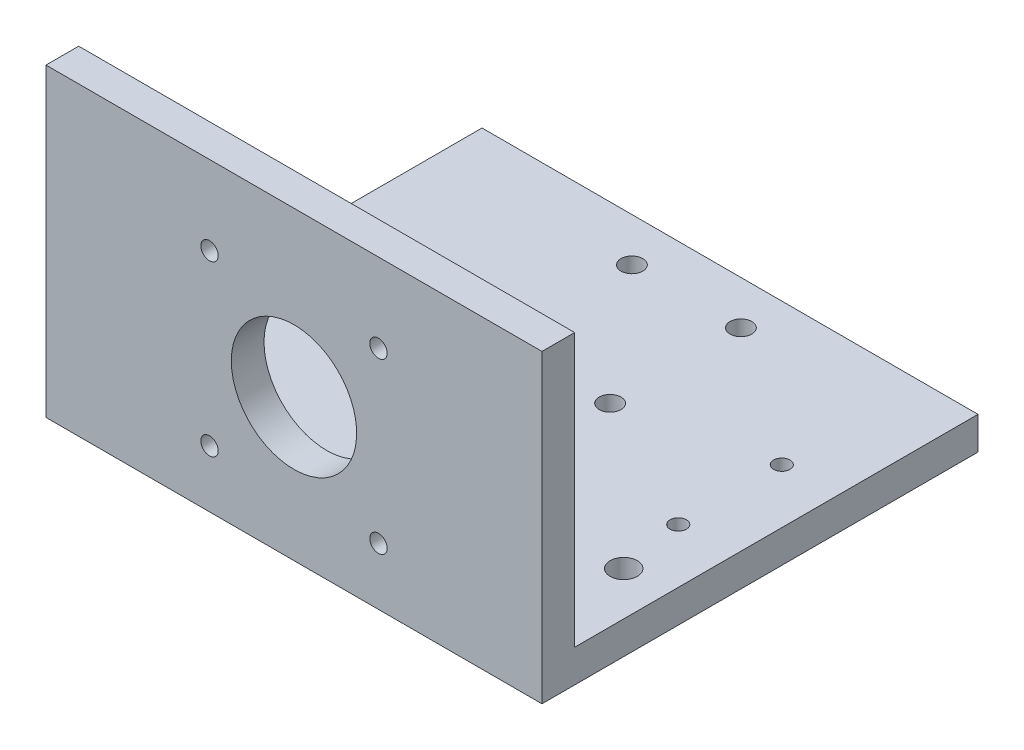
ISO-10303-21;
HEADER;
FILE_DESCRIPTION(('STEP AP214'),'2;1');
FILE_NAME('part.step','',(''),(''),'','','');
FILE_SCHEMA(('AUTOMOTIVE_DESIGN { 1 0 10303 214 1 1 1 1 }'));
ENDSEC;
DATA;
#1=APPLICATION_CONTEXT('core data for automotive mechanical design processes');
#2=APPLICATION_PROTOCOL_DEFINITION('international standard','automotive_design',2000,#1);
#3=PRODUCT_CONTEXT('',#1,'mechanical');
#4=PRODUCT('Part','Part','',(#3));
#5=PRODUCT_RELATED_PRODUCT_CATEGORY('part','',(#4));
#6=PRODUCT_DEFINITION_FORMATION('','',#4);
#7=PRODUCT_DEFINITION_CONTEXT('part definition',#1,'design');
#8=PRODUCT_DEFINITION('design','',#6,#7);
#9=PRODUCT_DEFINITION_SHAPE('','',#8);
#10=(LENGTH_UNIT() NAMED_UNIT(*) SI_UNIT(.MILLI.,.METRE.));
#11=(NAMED_UNIT(*) PLANE_ANGLE_UNIT() SI_UNIT($,.RADIAN.));
#12=(NAMED_UNIT(*) SI_UNIT($,.STERADIAN.) SOLID_ANGLE_UNIT());
#13=UNCERTAINTY_MEASURE_WITH_UNIT(LENGTH_MEASURE(1.E-05),#10,'distance_accuracy_value','');
#14=(GEOMETRIC_REPRESENTATION_CONTEXT(3) GLOBAL_UNCERTAINTY_ASSIGNED_CONTEXT((#13)) GLOBAL_UNIT_ASSIGNED_CONTEXT((#10,
#11,#12)) REPRESENTATION_CONTEXT('',''));
#15=CARTESIAN_POINT('',(0.,0.,0.));
#16=DIRECTION('',(0.,0.,1.));
#17=DIRECTION('',(1.,0.,0.));
#18=AXIS2_PLACEMENT_3D('',#15,#16,#17);
#19=CARTESIAN_POINT('',(104.,0.,0.));
#20=DIRECTION('',(0.,1.,0.));
#21=DIRECTION('',(0.,0.,1.));
#22=AXIS2_PLACEMENT_3D('',#19,#20,#21);
#23=PLANE('',#22);
#24=CARTESIAN_POINT('',(57.5,0.,-23.));
#25=DIRECTION('',(0.,1.,0.));
#26=DIRECTION('',(0.,0.,1.));
#27=AXIS2_PLACEMENT_3D('',#24,#25,#26);
#28=CIRCLE('',#27,2.49999999999999);
#29=CARTESIAN_POINT('',(57.5,0.,-20.5));
#30=VERTEX_POINT('',#29);
#31=EDGE_CURVE('E253',#30,#30,#28,.T.);
#32=ORIENTED_EDGE('',*,*,#31,.T.);
#33=EDGE_LOOP('',(#32));
#34=FACE_BOUND('',#33,.T.);
#35=CARTESIAN_POINT('',(61.,0.,-11.));
#36=DIRECTION('',(0.,1.,0.));
#37=DIRECTION('',(0.,0.,-1.));
#38=AXIS2_PLACEMENT_3D('',#35,#36,#37);
#39=CIRCLE('',#38,2.);
#40=CARTESIAN_POINT('',(61.,0.,-13.));
#41=VERTEX_POINT('',#40);
#42=EDGE_CURVE('E245',#41,#41,#39,.T.);
#43=ORIENTED_EDGE('',*,*,#42,.T.);
#44=EDGE_LOOP('',(#43));
#45=FACE_BOUND('',#44,.T.);
#46=CARTESIAN_POINT('',(61.0000000000001,0.,-35.));
#47=DIRECTION('',(0.,1.,0.));
#48=DIRECTION('',(0.,0.,-1.));
#49=AXIS2_PLACEMENT_3D('',#46,#47,#48);
#50=CIRCLE('',#49,1.99999999999999);
#51=CARTESIAN_POINT('',(61.0000000000001,0.,-37.));
#52=VERTEX_POINT('',#51);
#53=EDGE_CURVE('E237',#52,#52,#50,.T.);
#54=ORIENTED_EDGE('',*,*,#53,.T.);
#55=EDGE_LOOP('',(#54));
#56=FACE_BOUND('',#55,.T.);
#57=CARTESIAN_POINT('',(62.,0.,-48.));
#58=DIRECTION('',(0.,1.,0.));
#59=DIRECTION('',(0.,0.,-1.));
#60=AXIS2_PLACEMENT_3D('',#57,#58,#59);
#61=CIRCLE('',#60,1.99999999999998);
#62=CARTESIAN_POINT('',(62.,0.,-50.));
#63=VERTEX_POINT('',#62);
#64=EDGE_CURVE('E228',#63,#63,#61,.T.);
#65=ORIENTED_EDGE('',*,*,#64,.T.);
#66=EDGE_LOOP('',(#65));
#67=FACE_BOUND('',#66,.T.);
#68=CARTESIAN_POINT('',(62.,0.,-72.));
#69=DIRECTION('',(0.,1.,0.));
#70=DIRECTION('',(0.,0.,-1.));
#71=AXIS2_PLACEMENT_3D('',#68,#69,#70);
#72=CIRCLE('',#71,2.);
#73=CARTESIAN_POINT('',(62.,0.,-74.));
#74=VERTEX_POINT('',#73);
#75=EDGE_CURVE('E285',#74,#74,#72,.T.);
#76=ORIENTED_EDGE('',*,*,#75,.T.);
#77=EDGE_LOOP('',(#76));
#78=FACE_BOUND('',#77,.T.);
#79=CARTESIAN_POINT('',(42.,0.,-72.));
#80=DIRECTION('',(0.,1.,0.));
#81=DIRECTION('',(0.,0.,1.));
#82=AXIS2_PLACEMENT_3D('',#79,#80,#81);
#83=CIRCLE('',#82,2.);
#84=CARTESIAN_POINT('',(42.,0.,-70.));
#85=VERTEX_POINT('',#84);
#86=EDGE_CURVE('E277',#85,#85,#83,.T.);
#87=ORIENTED_EDGE('',*,*,#86,.T.);
#88=EDGE_LOOP('',(#87));
#89=FACE_BOUND('',#88,.T.);
#90=CARTESIAN_POINT('',(42.,0.,-48.));
#91=DIRECTION('',(0.,1.,0.));
#92=DIRECTION('',(0.,0.,1.));
#93=AXIS2_PLACEMENT_3D('',#90,#91,#92);
#94=CIRCLE('',#93,2.);
#95=CARTESIAN_POINT('',(42.,0.,-46.));
#96=VERTEX_POINT('',#95);
#97=EDGE_CURVE('E269',#96,#96,#94,.T.);
#98=ORIENTED_EDGE('',*,*,#97,.T.);
#99=EDGE_LOOP('',(#98));
#100=FACE_BOUND('',#99,.T.);
#101=CARTESIAN_POINT('',(42.9999999999999,0.,-35.));
#102=DIRECTION('',(0.,1.,0.));
#103=DIRECTION('',(0.,0.,1.));
#104=AXIS2_PLACEMENT_3D('',#101,#102,#103);
#105=CIRCLE('',#104,2.);
#106=CARTESIAN_POINT('',(42.9999999999999,0.,-33.));
#107=VERTEX_POINT('',#106);
#108=EDGE_CURVE('E260',#107,#107,#105,.T.);
#109=ORIENTED_EDGE('',*,*,#108,.T.);
#110=EDGE_LOOP('',(#109));
#111=FACE_BOUND('',#110,.T.);
#112=CARTESIAN_POINT('',(87.5,0.,-35.));
#113=DIRECTION('',(0.,1.,0.));
#114=DIRECTION('',(0.,0.,-1.));
#115=AXIS2_PLACEMENT_3D('',#112,#113,#114);
#116=CIRCLE('',#115,1.5);
#117=CARTESIAN_POINT('',(87.5,0.,-36.5));
#118=VERTEX_POINT('',#117);
#119=EDGE_CURVE('E189',#118,#118,#116,.T.);
#120=ORIENTED_EDGE('',*,*,#119,.T.);
#121=EDGE_LOOP('',(#120));
#122=FACE_BOUND('',#121,.T.);
#123=CARTESIAN_POINT('',(87.5,0.,-54.));
#124=DIRECTION('',(0.,1.,0.));
#125=DIRECTION('',(0.,0.,-1.));
#126=AXIS2_PLACEMENT_3D('',#123,#124,#125);
#127=CIRCLE('',#126,1.5);
#128=CARTESIAN_POINT('',(87.5,0.,-55.5));
#129=VERTEX_POINT('',#128);
#130=EDGE_CURVE('E174',#129,#129,#127,.T.);
#131=ORIENTED_EDGE('',*,*,#130,.T.);
#132=EDGE_LOOP('',(#131));
#133=FACE_BOUND('',#132,.T.);
#134=CARTESIAN_POINT('',(89.5,0.,-23.));
#135=DIRECTION('',(0.,1.,0.));
#136=DIRECTION('',(0.,0.,1.));
#137=AXIS2_PLACEMENT_3D('',#134,#135,#136);
#138=CIRCLE('',#137,2.5);
#139=CARTESIAN_POINT('',(89.5,0.,-20.5));
#140=VERTEX_POINT('',#139);
#141=EDGE_CURVE('E212',#140,#140,#138,.T.);
#142=ORIENTED_EDGE('',*,*,#141,.T.);
#143=EDGE_LOOP('',(#142));
#144=FACE_BOUND('',#143,.T.);
#145=CARTESIAN_POINT('',(46.5,0.,-23.));
#146=DIRECTION('',(0.,1.,0.));
#147=DIRECTION('',(0.,0.,-1.));
#148=AXIS2_PLACEMENT_3D('',#145,#146,#147);
#149=CIRCLE('',#148,2.49999999999999);
#150=CARTESIAN_POINT('',(46.5,0.,-25.5));
#151=VERTEX_POINT('',#150);
#152=EDGE_CURVE('E221',#151,#151,#149,.T.);
#153=ORIENTED_EDGE('',*,*,#152,.T.);
#154=EDGE_LOOP('',(#153));
#155=FACE_BOUND('',#154,.T.);
#156=CARTESIAN_POINT('',(14.5,0.,-23.));
#157=DIRECTION('',(0.,1.,0.));
#158=DIRECTION('',(0.,0.,-1.));
#159=AXIS2_PLACEMENT_3D('',#156,#157,#158);
#160=CIRCLE('',#159,2.5);
#161=CARTESIAN_POINT('',(14.5,0.,-25.5));
#162=VERTEX_POINT('',#161);
#163=EDGE_CURVE('E199',#162,#162,#160,.T.);
#164=ORIENTED_EDGE('',*,*,#163,.T.);
#165=EDGE_LOOP('',(#164));
#166=FACE_BOUND('',#165,.T.);
#167=CARTESIAN_POINT('',(43.,0.,-11.));
#168=DIRECTION('',(0.,1.,0.));
#169=DIRECTION('',(0.,0.,1.));
#170=AXIS2_PLACEMENT_3D('',#167,#168,#169);
#171=CIRCLE('',#170,2.);
#172=CARTESIAN_POINT('',(43.,0.,-9.00000000000001));
#173=VERTEX_POINT('',#172);
#174=EDGE_CURVE('E292',#173,#173,#171,.T.);
#175=ORIENTED_EDGE('',*,*,#174,.T.);
#176=EDGE_LOOP('',(#175));
#177=FACE_BOUND('',#176,.T.);
#178=DIRECTION('',(-1.,0.,0.));
#179=VECTOR('',#178,1.);
#180=CARTESIAN_POINT('',(104.,0.,0.));
#181=LINE('',#180,#179);
#182=CARTESIAN_POINT('',(97.5,0.,0.));
#183=VERTEX_POINT('',#182);
#184=CARTESIAN_POINT('',(6.49999999999999,0.,0.));
#185=VERTEX_POINT('',#184);
#186=EDGE_CURVE('E11',#183,#185,#181,.T.);
#187=ORIENTED_EDGE('',*,*,#186,.T.);
#188=DIRECTION('',(0.,0.,-1.));
#189=VECTOR('',#188,1.);
#190=CARTESIAN_POINT('',(6.49999999999999,0.,-6.00000000000001));
#191=LINE('',#190,#189);
#192=CARTESIAN_POINT('',(6.49999999999999,0.,-80.));
#193=VERTEX_POINT('',#192);
#194=EDGE_CURVE('E182',#185,#193,#191,.T.);
#195=ORIENTED_EDGE('',*,*,#194,.T.);
#196=DIRECTION('',(-1.,0.,0.));
#197=VECTOR('',#196,1.);
#198=CARTESIAN_POINT('',(104.,0.,-80.));
#199=LINE('',#198,#197);
#200=CARTESIAN_POINT('',(97.5,0.,-80.));
#201=VERTEX_POINT('',#200);
#202=EDGE_CURVE('E50',#201,#193,#199,.T.);
#203=ORIENTED_EDGE('',*,*,#202,.F.);
#204=DIRECTION('',(0.,0.,1.));
#205=VECTOR('',#204,1.);
#206=CARTESIAN_POINT('',(97.5,0.,-6.00000000000001));
#207=LINE('',#206,#205);
#208=EDGE_CURVE('E56',#201,#183,#207,.T.);
#209=ORIENTED_EDGE('',*,*,#208,.T.);
#210=EDGE_LOOP('',(#187,#195,#203,#209));
#211=FACE_BOUND('',#210,.T.);
#212=ADVANCED_FACE('F41',(#34,#45,#56,#67,#78,#89,#100,#111,#122,#133,#144,#155,#166,#177,#211),
#23,.F.);
#213=CARTESIAN_POINT('',(104.,0.,-80.));
#214=DIRECTION('',(0.,0.,1.));
#215=DIRECTION('',(1.,0.,0.));
#216=AXIS2_PLACEMENT_3D('',#213,#214,#215);
#217=PLANE('',#216);
#218=ORIENTED_EDGE('',*,*,#202,.T.);
#219=DIRECTION('',(0.,1.,0.));
#220=VECTOR('',#219,1.);
#221=CARTESIAN_POINT('',(6.49999999999999,0.,-80.));
#222=LINE('',#221,#220);
#223=CARTESIAN_POINT('',(6.49999999999999,6.,-80.));
#224=VERTEX_POINT('',#223);
#225=EDGE_CURVE('E185',#193,#224,#222,.T.);
#226=ORIENTED_EDGE('',*,*,#225,.T.);
#227=DIRECTION('',(-1.,0.,0.));
#228=VECTOR('',#227,1.);
#229=CARTESIAN_POINT('',(104.,6.,-80.));
#230=LINE('',#229,#228);
#231=CARTESIAN_POINT('',(97.5,6.,-80.));
#232=VERTEX_POINT('',#231);
#233=EDGE_CURVE('E303',#232,#224,#230,.T.);
#234=ORIENTED_EDGE('',*,*,#233,.F.);
#235=DIRECTION('',(0.,1.,0.));
#236=VECTOR('',#235,1.);
#237=CARTESIAN_POINT('',(97.5,0.,-80.));
#238=LINE('',#237,#236);
#239=EDGE_CURVE('E93',#201,#232,#238,.T.);
#240=ORIENTED_EDGE('',*,*,#239,.F.);
#241=EDGE_LOOP('',(#218,#226,#234,#240));
#242=FACE_BOUND('',#241,.T.);
#243=ADVANCED_FACE('F308',(#242),#217,.F.);
#244=CARTESIAN_POINT('',(104.,6.,-6.));
#245=DIRECTION('',(0.,-1.,0.));
#246=DIRECTION('',(0.,0.,-1.));
#247=AXIS2_PLACEMENT_3D('',#244,#245,#246);
#248=PLANE('',#247);
#249=CARTESIAN_POINT('',(57.5,6.,-23.));
#250=DIRECTION('',(0.,1.,0.));
#251=DIRECTION('',(0.,0.,1.));
#252=AXIS2_PLACEMENT_3D('',#249,#250,#251);
#253=CIRCLE('',#252,2.49999999999999);
#254=CARTESIAN_POINT('',(57.5,6.,-20.5));
#255=VERTEX_POINT('',#254);
#256=EDGE_CURVE('E216',#255,#255,#253,.T.);
#257=ORIENTED_EDGE('',*,*,#256,.F.);
#258=EDGE_LOOP('',(#257));
#259=FACE_BOUND('',#258,.T.);
#260=CARTESIAN_POINT('',(61.,6.,-11.));
#261=DIRECTION('',(0.,1.,0.));
#262=DIRECTION('',(0.,0.,-1.));
#263=AXIS2_PLACEMENT_3D('',#260,#261,#262);
#264=CIRCLE('',#263,2.);
#265=CARTESIAN_POINT('',(61.,6.,-13.));
#266=VERTEX_POINT('',#265);
#267=EDGE_CURVE('E249',#266,#266,#264,.T.);
#268=ORIENTED_EDGE('',*,*,#267,.F.);
#269=EDGE_LOOP('',(#268));
#270=FACE_BOUND('',#269,.T.);
#271=CARTESIAN_POINT('',(61.0000000000001,6.,-35.));
#272=DIRECTION('',(0.,1.,0.));
#273=DIRECTION('',(0.,0.,-1.));
#274=AXIS2_PLACEMENT_3D('',#271,#272,#273);
#275=CIRCLE('',#274,1.99999999999999);
#276=CARTESIAN_POINT('',(61.0000000000001,6.,-37.));
#277=VERTEX_POINT('',#276);
#278=EDGE_CURVE('E241',#277,#277,#275,.T.);
#279=ORIENTED_EDGE('',*,*,#278,.F.);
#280=EDGE_LOOP('',(#279));
#281=FACE_BOUND('',#280,.T.);
#282=CARTESIAN_POINT('',(62.,6.,-48.));
#283=DIRECTION('',(0.,1.,0.));
#284=DIRECTION('',(0.,0.,-1.));
#285=AXIS2_PLACEMENT_3D('',#282,#283,#284);
#286=CIRCLE('',#285,1.99999999999998);
#287=CARTESIAN_POINT('',(62.,6.,-50.));
#288=VERTEX_POINT('',#287);
#289=EDGE_CURVE('E233',#288,#288,#286,.T.);
#290=ORIENTED_EDGE('',*,*,#289,.F.);
#291=EDGE_LOOP('',(#290));
#292=FACE_BOUND('',#291,.T.);
#293=CARTESIAN_POINT('',(62.,6.,-72.));
#294=DIRECTION('',(0.,1.,0.));
#295=DIRECTION('',(0.,0.,-1.));
#296=AXIS2_PLACEMENT_3D('',#293,#294,#295);
#297=CIRCLE('',#296,2.);
#298=CARTESIAN_POINT('',(62.,6.,-74.));
#299=VERTEX_POINT('',#298);
#300=EDGE_CURVE('E232',#299,#299,#297,.T.);
#301=ORIENTED_EDGE('',*,*,#300,.F.);
#302=EDGE_LOOP('',(#301));
#303=FACE_BOUND('',#302,.T.);
#304=CARTESIAN_POINT('',(42.,6.,-72.));
#305=DIRECTION('',(0.,1.,0.));
#306=DIRECTION('',(0.,0.,1.));
#307=AXIS2_PLACEMENT_3D('',#304,#305,#306);
#308=CIRCLE('',#307,2.);
#309=CARTESIAN_POINT('',(42.,6.,-70.));
#310=VERTEX_POINT('',#309);
#311=EDGE_CURVE('E281',#310,#310,#308,.T.);
#312=ORIENTED_EDGE('',*,*,#311,.F.);
#313=EDGE_LOOP('',(#312));
#314=FACE_BOUND('',#313,.T.);
#315=CARTESIAN_POINT('',(42.,6.,-48.));
#316=DIRECTION('',(0.,1.,0.));
#317=DIRECTION('',(0.,0.,1.));
#318=AXIS2_PLACEMENT_3D('',#315,#316,#317);
#319=CIRCLE('',#318,2.);
#320=CARTESIAN_POINT('',(42.,6.,-46.));
#321=VERTEX_POINT('',#320);
#322=EDGE_CURVE('E273',#321,#321,#319,.T.);
#323=ORIENTED_EDGE('',*,*,#322,.F.);
#324=EDGE_LOOP('',(#323));
#325=FACE_BOUND('',#324,.T.);
#326=CARTESIAN_POINT('',(42.9999999999999,6.,-35.));
#327=DIRECTION('',(0.,1.,0.));
#328=DIRECTION('',(0.,0.,1.));
#329=AXIS2_PLACEMENT_3D('',#326,#327,#328);
#330=CIRCLE('',#329,2.);
#331=CARTESIAN_POINT('',(42.9999999999999,6.,-33.));
#332=VERTEX_POINT('',#331);
#333=EDGE_CURVE('E265',#332,#332,#330,.T.);
#334=ORIENTED_EDGE('',*,*,#333,.F.);
#335=EDGE_LOOP('',(#334));
#336=FACE_BOUND('',#335,.T.);
#337=CARTESIAN_POINT('',(87.5,6.,-35.));
#338=DIRECTION('',(0.,1.,0.));
#339=DIRECTION('',(0.,0.,-1.));
#340=AXIS2_PLACEMENT_3D('',#337,#338,#339);
#341=CIRCLE('',#340,1.5);
#342=CARTESIAN_POINT('',(87.5,6.,-36.5));
#343=VERTEX_POINT('',#342);
#344=EDGE_CURVE('E178',#343,#343,#341,.T.);
#345=ORIENTED_EDGE('',*,*,#344,.F.);
#346=EDGE_LOOP('',(#345));
#347=FACE_BOUND('',#346,.T.);
#348=CARTESIAN_POINT('',(87.5,6.,-54.));
#349=DIRECTION('',(0.,1.,0.));
#350=DIRECTION('',(0.,0.,-1.));
#351=AXIS2_PLACEMENT_3D('',#348,#349,#350);
#352=CIRCLE('',#351,1.5);
#353=CARTESIAN_POINT('',(87.5,6.,-55.5));
#354=VERTEX_POINT('',#353);
#355=EDGE_CURVE('E170',#354,#354,#352,.T.);
#356=ORIENTED_EDGE('',*,*,#355,.F.);
#357=EDGE_LOOP('',(#356));
#358=FACE_BOUND('',#357,.T.);
#359=CARTESIAN_POINT('',(89.5,6.,-23.));
#360=DIRECTION('',(0.,1.,0.));
#361=DIRECTION('',(0.,0.,1.));
#362=AXIS2_PLACEMENT_3D('',#359,#360,#361);
#363=CIRCLE('',#362,2.5);
#364=CARTESIAN_POINT('',(89.5,6.,-20.5));
#365=VERTEX_POINT('',#364);
#366=EDGE_CURVE('E217',#365,#365,#363,.T.);
#367=ORIENTED_EDGE('',*,*,#366,.F.);
#368=EDGE_LOOP('',(#367));
#369=FACE_BOUND('',#368,.T.);
#370=CARTESIAN_POINT('',(46.5,6.,-23.));
#371=DIRECTION('',(0.,1.,0.));
#372=DIRECTION('',(0.,0.,-1.));
#373=AXIS2_PLACEMENT_3D('',#370,#371,#372);
#374=CIRCLE('',#373,2.49999999999999);
#375=CARTESIAN_POINT('',(46.5,6.,-25.5));
#376=VERTEX_POINT('',#375);
#377=EDGE_CURVE('E203',#376,#376,#374,.T.);
#378=ORIENTED_EDGE('',*,*,#377,.F.);
#379=EDGE_LOOP('',(#378));
#380=FACE_BOUND('',#379,.T.);
#381=CARTESIAN_POINT('',(14.5,6.,-23.));
#382=DIRECTION('',(0.,1.,0.));
#383=DIRECTION('',(0.,0.,-1.));
#384=AXIS2_PLACEMENT_3D('',#381,#382,#383);
#385=CIRCLE('',#384,2.5);
#386=CARTESIAN_POINT('',(14.5,6.,-25.5));
#387=VERTEX_POINT('',#386);
#388=EDGE_CURVE('E204',#387,#387,#385,.T.);
#389=ORIENTED_EDGE('',*,*,#388,.F.);
#390=EDGE_LOOP('',(#389));
#391=FACE_BOUND('',#390,.T.);
#392=CARTESIAN_POINT('',(43.,6.,-11.));
#393=DIRECTION('',(0.,1.,0.));
#394=DIRECTION('',(0.,0.,1.));
#395=AXIS2_PLACEMENT_3D('',#392,#393,#394);
#396=CIRCLE('',#395,2.);
#397=CARTESIAN_POINT('',(43.,6.,-9.00000000000001));
#398=VERTEX_POINT('',#397);
#399=EDGE_CURVE('E264',#398,#398,#396,.T.);
#400=ORIENTED_EDGE('',*,*,#399,.F.);
#401=EDGE_LOOP('',(#400));
#402=FACE_BOUND('',#401,.T.);
#403=ORIENTED_EDGE('',*,*,#233,.T.);
#404=DIRECTION('',(0.,0.,-1.));
#405=VECTOR('',#404,1.);
#406=CARTESIAN_POINT('',(6.49999999999999,6.,-6.00000000000001));
#407=LINE('',#406,#405);
#408=CARTESIAN_POINT('',(6.49999999999999,6.,-6.));
#409=VERTEX_POINT('',#408);
#410=EDGE_CURVE('E186',#409,#224,#407,.T.);
#411=ORIENTED_EDGE('',*,*,#410,.F.);
#412=DIRECTION('',(-1.,0.,0.));
#413=VECTOR('',#412,1.);
#414=CARTESIAN_POINT('',(104.,6.,-6.));
#415=LINE('',#414,#413);
#416=CARTESIAN_POINT('',(97.5,6.,-6.));
#417=VERTEX_POINT('',#416);
#418=EDGE_CURVE('E296',#417,#409,#415,.T.);
#419=ORIENTED_EDGE('',*,*,#418,.F.);
#420=DIRECTION('',(0.,0.,1.));
#421=VECTOR('',#420,1.);
#422=CARTESIAN_POINT('',(97.5,6.,-6.00000000000001));
#423=LINE('',#422,#421);
#424=EDGE_CURVE('E94',#232,#417,#423,.T.);
#425=ORIENTED_EDGE('',*,*,#424,.F.);
#426=EDGE_LOOP('',(#403,#411,#419,#425));
#427=FACE_BOUND('',#426,.T.);
#428=ADVANCED_FACE('F313',(#259,#270,#281,#292,#303,#314,#325,#336,#347,#358,#369,#380,#391,
#402,#427),#248,.F.);
#429=CARTESIAN_POINT('',(104.,6.,-6.));
#430=DIRECTION('',(0.,0.,1.));
#431=DIRECTION('',(1.,0.,0.));
#432=AXIS2_PLACEMENT_3D('',#429,#430,#431);
#433=PLANE('',#432);
#434=CARTESIAN_POINT('',(36.5,41.5,-6.));
#435=DIRECTION('',(0.,0.,-1.));
#436=DIRECTION('',(-1.,0.,0.));
#437=AXIS2_PLACEMENT_3D('',#434,#435,#436);
#438=CIRCLE('',#437,1.6);
#439=CARTESIAN_POINT('',(34.9,41.5,-6.));
#440=VERTEX_POINT('',#439);
#441=EDGE_CURVE('E139',#440,#440,#438,.T.);
#442=ORIENTED_EDGE('',*,*,#441,.F.);
#443=EDGE_LOOP('',(#442));
#444=FACE_BOUND('',#443,.T.);
#445=CARTESIAN_POINT('',(67.5,41.5,-6.));
#446=DIRECTION('',(0.,0.,-1.));
#447=DIRECTION('',(1.,0.,0.));
#448=AXIS2_PLACEMENT_3D('',#445,#446,#447);
#449=CIRCLE('',#448,1.59999999999999);
#450=CARTESIAN_POINT('',(69.1,41.5,-6.));
#451=VERTEX_POINT('',#450);
#452=EDGE_CURVE('E147',#451,#451,#449,.T.);
#453=ORIENTED_EDGE('',*,*,#452,.F.);
#454=EDGE_LOOP('',(#453));
#455=FACE_BOUND('',#454,.T.);
#456=CARTESIAN_POINT('',(67.5,10.5,-6.));
#457=DIRECTION('',(0.,0.,-1.));
#458=DIRECTION('',(-1.,0.,0.));
#459=AXIS2_PLACEMENT_3D('',#456,#457,#458);
#460=CIRCLE('',#459,1.59999999999999);
#461=CARTESIAN_POINT('',(65.9,10.5,-6.));
#462=VERTEX_POINT('',#461);
#463=EDGE_CURVE('E155',#462,#462,#460,.T.);
#464=ORIENTED_EDGE('',*,*,#463,.F.);
#465=EDGE_LOOP('',(#464));
#466=FACE_BOUND('',#465,.T.);
#467=CARTESIAN_POINT('',(36.5,10.5,-6.));
#468=DIRECTION('',(0.,0.,-1.));
#469=DIRECTION('',(1.,0.,0.));
#470=AXIS2_PLACEMENT_3D('',#467,#468,#469);
#471=CIRCLE('',#470,1.6);
#472=CARTESIAN_POINT('',(38.1,10.5,-6.));
#473=VERTEX_POINT('',#472);
#474=EDGE_CURVE('E132',#473,#473,#471,.T.);
#475=ORIENTED_EDGE('',*,*,#474,.F.);
#476=EDGE_LOOP('',(#475));
#477=FACE_BOUND('',#476,.T.);
#478=CARTESIAN_POINT('',(52.,26.,-6.));
#479=DIRECTION('',(0.,0.,-1.));
#480=DIRECTION('',(-1.,0.,0.));
#481=AXIS2_PLACEMENT_3D('',#478,#479,#480);
#482=CIRCLE('',#481,11.5);
#483=CARTESIAN_POINT('',(40.5,26.,-6.));
#484=VERTEX_POINT('',#483);
#485=EDGE_CURVE('E138',#484,#484,#482,.T.);
#486=ORIENTED_EDGE('',*,*,#485,.F.);
#487=EDGE_LOOP('',(#486));
#488=FACE_BOUND('',#487,.T.);
#489=ORIENTED_EDGE('',*,*,#418,.T.);
#490=DIRECTION('',(0.,-1.,0.));
#491=VECTOR('',#490,1.);
#492=CARTESIAN_POINT('',(6.49999999999999,0.,-6.));
#493=LINE('',#492,#491);
#494=CARTESIAN_POINT('',(6.49999999999999,56.,-6.));
#495=VERTEX_POINT('',#494);
#496=EDGE_CURVE('E107',#495,#409,#493,.T.);
#497=ORIENTED_EDGE('',*,*,#496,.F.);
#498=DIRECTION('',(-1.,0.,0.));
#499=VECTOR('',#498,1.);
#500=CARTESIAN_POINT('',(97.5,56.,-6.));
#501=LINE('',#500,#499);
#502=CARTESIAN_POINT('',(97.5,56.,-6.));
#503=VERTEX_POINT('',#502);
#504=EDGE_CURVE('E125',#503,#495,#501,.T.);
#505=ORIENTED_EDGE('',*,*,#504,.F.);
#506=DIRECTION('',(0.,1.,0.));
#507=VECTOR('',#506,1.);
#508=CARTESIAN_POINT('',(97.5,0.,-6.));
#509=LINE('',#508,#507);
#510=EDGE_CURVE('E122',#417,#503,#509,.T.);
#511=ORIENTED_EDGE('',*,*,#510,.F.);
#512=EDGE_LOOP('',(#489,#497,#505,#511));
#513=FACE_BOUND('',#512,.T.);
#514=ADVANCED_FACE('F317',(#444,#455,#466,#477,#488,#513),#433,.F.);
#515=CARTESIAN_POINT('',(104.,6.,0.));
#516=DIRECTION('',(0.,0.,-1.));
#517=DIRECTION('',(-1.,0.,0.));
#518=AXIS2_PLACEMENT_3D('',#515,#516,#517);
#519=PLANE('',#518);
#520=CARTESIAN_POINT('',(36.5,41.5,0.));
#521=DIRECTION('',(0.,0.,-1.));
#522=DIRECTION('',(-1.,0.,0.));
#523=AXIS2_PLACEMENT_3D('',#520,#521,#522);
#524=CIRCLE('',#523,1.6);
#525=CARTESIAN_POINT('',(34.9,41.5,0.));
#526=VERTEX_POINT('',#525);
#527=EDGE_CURVE('E134',#526,#526,#524,.T.);
#528=ORIENTED_EDGE('',*,*,#527,.T.);
#529=EDGE_LOOP('',(#528));
#530=FACE_BOUND('',#529,.T.);
#531=CARTESIAN_POINT('',(67.5,41.5,0.));
#532=DIRECTION('',(0.,0.,-1.));
#533=DIRECTION('',(1.,0.,0.));
#534=AXIS2_PLACEMENT_3D('',#531,#532,#533);
#535=CIRCLE('',#534,1.59999999999999);
#536=CARTESIAN_POINT('',(69.1,41.5,0.));
#537=VERTEX_POINT('',#536);
#538=EDGE_CURVE('E143',#537,#537,#535,.T.);
#539=ORIENTED_EDGE('',*,*,#538,.T.);
#540=EDGE_LOOP('',(#539));
#541=FACE_BOUND('',#540,.T.);
#542=CARTESIAN_POINT('',(67.5,10.5,0.));
#543=DIRECTION('',(0.,0.,-1.));
#544=DIRECTION('',(-1.,0.,0.));
#545=AXIS2_PLACEMENT_3D('',#542,#543,#544);
#546=CIRCLE('',#545,1.59999999999999);
#547=CARTESIAN_POINT('',(65.9,10.5,0.));
#548=VERTEX_POINT('',#547);
#549=EDGE_CURVE('E151',#548,#548,#546,.T.);
#550=ORIENTED_EDGE('',*,*,#549,.T.);
#551=EDGE_LOOP('',(#550));
#552=FACE_BOUND('',#551,.T.);
#553=CARTESIAN_POINT('',(36.5,10.5,0.));
#554=DIRECTION('',(0.,0.,-1.));
#555=DIRECTION('',(1.,0.,0.));
#556=AXIS2_PLACEMENT_3D('',#553,#554,#555);
#557=CIRCLE('',#556,1.6);
#558=CARTESIAN_POINT('',(38.1,10.5,0.));
#559=VERTEX_POINT('',#558);
#560=EDGE_CURVE('E159',#559,#559,#557,.T.);
#561=ORIENTED_EDGE('',*,*,#560,.T.);
#562=EDGE_LOOP('',(#561));
#563=FACE_BOUND('',#562,.T.);
#564=CARTESIAN_POINT('',(52.,26.,0.));
#565=DIRECTION('',(0.,0.,-1.));
#566=DIRECTION('',(-1.,0.,0.));
#567=AXIS2_PLACEMENT_3D('',#564,#565,#566);
#568=CIRCLE('',#567,11.5);
#569=CARTESIAN_POINT('',(40.5,26.,0.));
#570=VERTEX_POINT('',#569);
#571=EDGE_CURVE('E166',#570,#570,#568,.T.);
#572=ORIENTED_EDGE('',*,*,#571,.T.);
#573=EDGE_LOOP('',(#572));
#574=FACE_BOUND('',#573,.T.);
#575=DIRECTION('',(-1.,0.,0.));
#576=VECTOR('',#575,1.);
#577=CARTESIAN_POINT('',(97.5,56.,0.));
#578=LINE('',#577,#576);
#579=CARTESIAN_POINT('',(97.5,56.,0.));
#580=VERTEX_POINT('',#579);
#581=CARTESIAN_POINT('',(6.49999999999999,56.,0.));
#582=VERTEX_POINT('',#581);
#583=EDGE_CURVE('E106',#580,#582,#578,.T.);
#584=ORIENTED_EDGE('',*,*,#583,.T.);
#585=DIRECTION('',(0.,-1.,0.));
#586=VECTOR('',#585,1.);
#587=CARTESIAN_POINT('',(6.49999999999999,0.,0.));
#588=LINE('',#587,#586);
#589=EDGE_CURVE('E112',#582,#185,#588,.T.);
#590=ORIENTED_EDGE('',*,*,#589,.T.);
#591=ORIENTED_EDGE('',*,*,#186,.F.);
#592=DIRECTION('',(0.,1.,0.));
#593=VECTOR('',#592,1.);
#594=CARTESIAN_POINT('',(97.5,0.,0.));
#595=LINE('',#594,#593);
#596=EDGE_CURVE('E97',#183,#580,#595,.T.);
#597=ORIENTED_EDGE('',*,*,#596,.T.);
#598=EDGE_LOOP('',(#584,#590,#591,#597));
#599=FACE_BOUND('',#598,.T.);
#600=ADVANCED_FACE('F110',(#530,#541,#552,#563,#574,#599),#519,.F.);
#601=CARTESIAN_POINT('',(6.49999999999999,0.,-6.00000000000001));
#602=DIRECTION('',(1.,0.,0.));
#603=DIRECTION('',(0.,0.,-1.));
#604=AXIS2_PLACEMENT_3D('',#601,#602,#603);
#605=PLANE('',#604);
#606=ORIENTED_EDGE('',*,*,#410,.T.);
#607=ORIENTED_EDGE('',*,*,#225,.F.);
#608=ORIENTED_EDGE('',*,*,#194,.F.);
#609=ORIENTED_EDGE('',*,*,#589,.F.);
#610=DIRECTION('',(0.,0.,-1.));
#611=VECTOR('',#610,1.);
#612=CARTESIAN_POINT('',(6.49999999999999,56.,0.));
#613=LINE('',#612,#611);
#614=EDGE_CURVE('E118',#582,#495,#613,.T.);
#615=ORIENTED_EDGE('',*,*,#614,.T.);
#616=ORIENTED_EDGE('',*,*,#496,.T.);
#617=EDGE_LOOP('',(#606,#607,#608,#609,#615,#616));
#618=FACE_BOUND('',#617,.T.);
#619=ADVANCED_FACE('F321',(#618),#605,.F.);
#620=CARTESIAN_POINT('',(97.5,0.,-6.00000000000001));
#621=DIRECTION('',(-1.,0.,0.));
#622=DIRECTION('',(0.,0.,1.));
#623=AXIS2_PLACEMENT_3D('',#620,#621,#622);
#624=PLANE('',#623);
#625=ORIENTED_EDGE('',*,*,#424,.T.);
#626=ORIENTED_EDGE('',*,*,#510,.T.);
#627=DIRECTION('',(0.,0.,-1.));
#628=VECTOR('',#627,1.);
#629=CARTESIAN_POINT('',(97.5,56.,0.));
#630=LINE('',#629,#628);
#631=EDGE_CURVE('E101',#580,#503,#630,.T.);
#632=ORIENTED_EDGE('',*,*,#631,.F.);
#633=ORIENTED_EDGE('',*,*,#596,.F.);
#634=ORIENTED_EDGE('',*,*,#208,.F.);
#635=ORIENTED_EDGE('',*,*,#239,.T.);
#636=EDGE_LOOP('',(#625,#626,#632,#633,#634,#635));
#637=FACE_BOUND('',#636,.T.);
#638=ADVANCED_FACE('F99',(#637),#624,.F.);
#639=CARTESIAN_POINT('',(43.,0.,-11.));
#640=DIRECTION('',(0.,1.,0.));
#641=DIRECTION('',(0.,0.,1.));
#642=AXIS2_PLACEMENT_3D('',#639,#640,#641);
#643=CYLINDRICAL_SURFACE('',#642,2.);
#644=ORIENTED_EDGE('',*,*,#174,.F.);
#645=EDGE_LOOP('',(#644));
#646=FACE_BOUND('',#645,.T.);
#647=ORIENTED_EDGE('',*,*,#399,.T.);
#648=EDGE_LOOP('',(#647));
#649=FACE_BOUND('',#648,.T.);
#650=ADVANCED_FACE('F328',(#646,#649),#643,.F.);
#651=CARTESIAN_POINT('',(14.5,0.,-23.));
#652=DIRECTION('',(0.,1.,0.));
#653=DIRECTION('',(0.,0.,1.));
#654=AXIS2_PLACEMENT_3D('',#651,#652,#653);
#655=CYLINDRICAL_SURFACE('',#654,2.5);
#656=ORIENTED_EDGE('',*,*,#163,.F.);
#657=EDGE_LOOP('',(#656));
#658=FACE_BOUND('',#657,.T.);
#659=ORIENTED_EDGE('',*,*,#388,.T.);
#660=EDGE_LOOP('',(#659));
#661=FACE_BOUND('',#660,.T.);
#662=ADVANCED_FACE('F369',(#658,#661),#655,.F.);
#663=CARTESIAN_POINT('',(46.5,0.,-23.));
#664=DIRECTION('',(0.,1.,0.));
#665=DIRECTION('',(0.,0.,1.));
#666=AXIS2_PLACEMENT_3D('',#663,#664,#665);
#667=CYLINDRICAL_SURFACE('',#666,2.49999999999999);
#668=ORIENTED_EDGE('',*,*,#152,.F.);
#669=EDGE_LOOP('',(#668));
#670=FACE_BOUND('',#669,.T.);
#671=ORIENTED_EDGE('',*,*,#377,.T.);
#672=EDGE_LOOP('',(#671));
#673=FACE_BOUND('',#672,.T.);
#674=ADVANCED_FACE('F417',(#670,#673),#667,.F.);
#675=CARTESIAN_POINT('',(89.5,0.,-23.));
#676=DIRECTION('',(0.,1.,0.));
#677=DIRECTION('',(0.,0.,1.));
#678=AXIS2_PLACEMENT_3D('',#675,#676,#677);
#679=CYLINDRICAL_SURFACE('',#678,2.5);
#680=ORIENTED_EDGE('',*,*,#141,.F.);
#681=EDGE_LOOP('',(#680));
#682=FACE_BOUND('',#681,.T.);
#683=ORIENTED_EDGE('',*,*,#366,.T.);
#684=EDGE_LOOP('',(#683));
#685=FACE_BOUND('',#684,.T.);
#686=ADVANCED_FACE('F420',(#682,#685),#679,.F.);
#687=CARTESIAN_POINT('',(87.5,0.,-54.));
#688=DIRECTION('',(0.,1.,0.));
#689=DIRECTION('',(0.,0.,1.));
#690=AXIS2_PLACEMENT_3D('',#687,#688,#689);
#691=CYLINDRICAL_SURFACE('',#690,1.5);
#692=ORIENTED_EDGE('',*,*,#130,.F.);
#693=EDGE_LOOP('',(#692));
#694=FACE_BOUND('',#693,.T.);
#695=ORIENTED_EDGE('',*,*,#355,.T.);
#696=EDGE_LOOP('',(#695));
#697=FACE_BOUND('',#696,.T.);
#698=ADVANCED_FACE('F423',(#694,#697),#691,.F.);
#699=CARTESIAN_POINT('',(87.5,0.,-35.));
#700=DIRECTION('',(0.,1.,0.));
#701=DIRECTION('',(0.,0.,1.));
#702=AXIS2_PLACEMENT_3D('',#699,#700,#701);
#703=CYLINDRICAL_SURFACE('',#702,1.5);
#704=ORIENTED_EDGE('',*,*,#119,.F.);
#705=EDGE_LOOP('',(#704));
#706=FACE_BOUND('',#705,.T.);
#707=ORIENTED_EDGE('',*,*,#344,.T.);
#708=EDGE_LOOP('',(#707));
#709=FACE_BOUND('',#708,.T.);
#710=ADVANCED_FACE('F400',(#706,#709),#703,.F.);
#711=CARTESIAN_POINT('',(42.9999999999999,0.,-35.));
#712=DIRECTION('',(0.,1.,0.));
#713=DIRECTION('',(0.,0.,1.));
#714=AXIS2_PLACEMENT_3D('',#711,#712,#713);
#715=CYLINDRICAL_SURFACE('',#714,2.);
#716=ORIENTED_EDGE('',*,*,#108,.F.);
#717=EDGE_LOOP('',(#716));
#718=FACE_BOUND('',#717,.T.);
#719=ORIENTED_EDGE('',*,*,#333,.T.);
#720=EDGE_LOOP('',(#719));
#721=FACE_BOUND('',#720,.T.);
#722=ADVANCED_FACE('F396',(#718,#721),#715,.F.);
#723=CARTESIAN_POINT('',(42.,0.,-48.));
#724=DIRECTION('',(0.,1.,0.));
#725=DIRECTION('',(0.,0.,1.));
#726=AXIS2_PLACEMENT_3D('',#723,#724,#725);
#727=CYLINDRICAL_SURFACE('',#726,2.);
#728=ORIENTED_EDGE('',*,*,#97,.F.);
#729=EDGE_LOOP('',(#728));
#730=FACE_BOUND('',#729,.T.);
#731=ORIENTED_EDGE('',*,*,#322,.T.);
#732=EDGE_LOOP('',(#731));
#733=FACE_BOUND('',#732,.T.);
#734=ADVANCED_FACE('F392',(#730,#733),#727,.F.);
#735=CARTESIAN_POINT('',(42.,0.,-72.));
#736=DIRECTION('',(0.,1.,0.));
#737=DIRECTION('',(0.,0.,1.));
#738=AXIS2_PLACEMENT_3D('',#735,#736,#737);
#739=CYLINDRICAL_SURFACE('',#738,2.);
#740=ORIENTED_EDGE('',*,*,#86,.F.);
#741=EDGE_LOOP('',(#740));
#742=FACE_BOUND('',#741,.T.);
#743=ORIENTED_EDGE('',*,*,#311,.T.);
#744=EDGE_LOOP('',(#743));
#745=FACE_BOUND('',#744,.T.);
#746=ADVANCED_FACE('F388',(#742,#745),#739,.F.);
#747=CARTESIAN_POINT('',(62.,0.,-72.));
#748=DIRECTION('',(0.,1.,0.));
#749=DIRECTION('',(0.,0.,1.));
#750=AXIS2_PLACEMENT_3D('',#747,#748,#749);
#751=CYLINDRICAL_SURFACE('',#750,2.);
#752=ORIENTED_EDGE('',*,*,#75,.F.);
#753=EDGE_LOOP('',(#752));
#754=FACE_BOUND('',#753,.T.);
#755=ORIENTED_EDGE('',*,*,#300,.T.);
#756=EDGE_LOOP('',(#755));
#757=FACE_BOUND('',#756,.T.);
#758=ADVANCED_FACE('F384',(#754,#757),#751,.F.);
#759=CARTESIAN_POINT('',(62.,0.,-48.));
#760=DIRECTION('',(0.,1.,0.));
#761=DIRECTION('',(0.,0.,1.));
#762=AXIS2_PLACEMENT_3D('',#759,#760,#761);
#763=CYLINDRICAL_SURFACE('',#762,1.99999999999998);
#764=ORIENTED_EDGE('',*,*,#64,.F.);
#765=EDGE_LOOP('',(#764));
#766=FACE_BOUND('',#765,.T.);
#767=ORIENTED_EDGE('',*,*,#289,.T.);
#768=EDGE_LOOP('',(#767));
#769=FACE_BOUND('',#768,.T.);
#770=ADVANCED_FACE('F387',(#766,#769),#763,.F.);
#771=CARTESIAN_POINT('',(61.0000000000001,0.,-35.));
#772=DIRECTION('',(0.,1.,0.));
#773=DIRECTION('',(0.,0.,1.));
#774=AXIS2_PLACEMENT_3D('',#771,#772,#773);
#775=CYLINDRICAL_SURFACE('',#774,1.99999999999999);
#776=ORIENTED_EDGE('',*,*,#53,.F.);
#777=EDGE_LOOP('',(#776));
#778=FACE_BOUND('',#777,.T.);
#779=ORIENTED_EDGE('',*,*,#278,.T.);
#780=EDGE_LOOP('',(#779));
#781=FACE_BOUND('',#780,.T.);
#782=ADVANCED_FACE('F409',(#778,#781),#775,.F.);
#783=CARTESIAN_POINT('',(61.,0.,-11.));
#784=DIRECTION('',(0.,1.,0.));
#785=DIRECTION('',(0.,0.,1.));
#786=AXIS2_PLACEMENT_3D('',#783,#784,#785);
#787=CYLINDRICAL_SURFACE('',#786,2.);
#788=ORIENTED_EDGE('',*,*,#42,.F.);
#789=EDGE_LOOP('',(#788));
#790=FACE_BOUND('',#789,.T.);
#791=ORIENTED_EDGE('',*,*,#267,.T.);
#792=EDGE_LOOP('',(#791));
#793=FACE_BOUND('',#792,.T.);
#794=ADVANCED_FACE('F405',(#790,#793),#787,.F.);
#795=CARTESIAN_POINT('',(57.5,0.,-23.));
#796=DIRECTION('',(0.,1.,0.));
#797=DIRECTION('',(0.,0.,1.));
#798=AXIS2_PLACEMENT_3D('',#795,#796,#797);
#799=CYLINDRICAL_SURFACE('',#798,2.49999999999999);
#800=ORIENTED_EDGE('',*,*,#31,.F.);
#801=EDGE_LOOP('',(#800));
#802=FACE_BOUND('',#801,.T.);
#803=ORIENTED_EDGE('',*,*,#256,.T.);
#804=EDGE_LOOP('',(#803));
#805=FACE_BOUND('',#804,.T.);
#806=ADVANCED_FACE('F402',(#802,#805),#799,.F.);
#807=CARTESIAN_POINT('',(97.5,56.,0.));
#808=DIRECTION('',(0.,-1.,0.));
#809=DIRECTION('',(0.,0.,-1.));
#810=AXIS2_PLACEMENT_3D('',#807,#808,#809);
#811=PLANE('',#810);
#812=ORIENTED_EDGE('',*,*,#504,.T.);
#813=ORIENTED_EDGE('',*,*,#614,.F.);
#814=ORIENTED_EDGE('',*,*,#583,.F.);
#815=ORIENTED_EDGE('',*,*,#631,.T.);
#816=EDGE_LOOP('',(#812,#813,#814,#815));
#817=FACE_BOUND('',#816,.T.);
#818=ADVANCED_FACE('F320',(#817),#811,.F.);
#819=CARTESIAN_POINT('',(52.,26.,0.));
#820=DIRECTION('',(0.,0.,-1.));
#821=DIRECTION('',(-1.,0.,0.));
#822=AXIS2_PLACEMENT_3D('',#819,#820,#821);
#823=CYLINDRICAL_SURFACE('',#822,11.5);
#824=ORIENTED_EDGE('',*,*,#571,.F.);
#825=EDGE_LOOP('',(#824));
#826=FACE_BOUND('',#825,.T.);
#827=ORIENTED_EDGE('',*,*,#485,.T.);
#828=EDGE_LOOP('',(#827));
#829=FACE_BOUND('',#828,.T.);
#830=ADVANCED_FACE('F452',(#826,#829),#823,.F.);
#831=CARTESIAN_POINT('',(36.5,10.5,0.));
#832=DIRECTION('',(0.,0.,-1.));
#833=DIRECTION('',(-1.,0.,0.));
#834=AXIS2_PLACEMENT_3D('',#831,#832,#833);
#835=CYLINDRICAL_SURFACE('',#834,1.6);
#836=ORIENTED_EDGE('',*,*,#560,.F.);
#837=EDGE_LOOP('',(#836));
#838=FACE_BOUND('',#837,.T.);
#839=ORIENTED_EDGE('',*,*,#474,.T.);
#840=EDGE_LOOP('',(#839));
#841=FACE_BOUND('',#840,.T.);
#842=ADVANCED_FACE('F455',(#838,#841),#835,.F.);
#843=CARTESIAN_POINT('',(67.5,10.5,0.));
#844=DIRECTION('',(0.,0.,-1.));
#845=DIRECTION('',(-1.,0.,0.));
#846=AXIS2_PLACEMENT_3D('',#843,#844,#845);
#847=CYLINDRICAL_SURFACE('',#846,1.59999999999999);
#848=ORIENTED_EDGE('',*,*,#549,.F.);
#849=EDGE_LOOP('',(#848));
#850=FACE_BOUND('',#849,.T.);
#851=ORIENTED_EDGE('',*,*,#463,.T.);
#852=EDGE_LOOP('',(#851));
#853=FACE_BOUND('',#852,.T.);
#854=ADVANCED_FACE('F459',(#850,#853),#847,.F.);
#855=CARTESIAN_POINT('',(67.5,41.5,0.));
#856=DIRECTION('',(0.,0.,-1.));
#857=DIRECTION('',(-1.,0.,0.));
#858=AXIS2_PLACEMENT_3D('',#855,#856,#857);
#859=CYLINDRICAL_SURFACE('',#858,1.59999999999999);
#860=ORIENTED_EDGE('',*,*,#538,.F.);
#861=EDGE_LOOP('',(#860));
#862=FACE_BOUND('',#861,.T.);
#863=ORIENTED_EDGE('',*,*,#452,.T.);
#864=EDGE_LOOP('',(#863));
#865=FACE_BOUND('',#864,.T.);
#866=ADVANCED_FACE('F463',(#862,#865),#859,.F.);
#867=CARTESIAN_POINT('',(36.5,41.5,0.));
#868=DIRECTION('',(0.,0.,-1.));
#869=DIRECTION('',(-1.,0.,0.));
#870=AXIS2_PLACEMENT_3D('',#867,#868,#869);
#871=CYLINDRICAL_SURFACE('',#870,1.6);
#872=ORIENTED_EDGE('',*,*,#527,.F.);
#873=EDGE_LOOP('',(#872));
#874=FACE_BOUND('',#873,.T.);
#875=ORIENTED_EDGE('',*,*,#441,.T.);
#876=EDGE_LOOP('',(#875));
#877=FACE_BOUND('',#876,.T.);
#878=ADVANCED_FACE('F467',(#874,#877),#871,.F.);
#879=CLOSED_SHELL('',(#212,#243,#428,#514,#600,#619,#638,#650,#662,#674,#686,#698,#710,#722,
#734,#746,#758,#770,#782,#794,#806,#818,#830,#842,#854,#866,#878));
#880=MANIFOLD_SOLID_BREP('B2',#879);
#881=ADVANCED_BREP_SHAPE_REPRESENTATION('',(#18,#880),#14);
#882=SHAPE_DEFINITION_REPRESENTATION(#9,#881);
ENDSEC;
END-ISO-10303-21;
